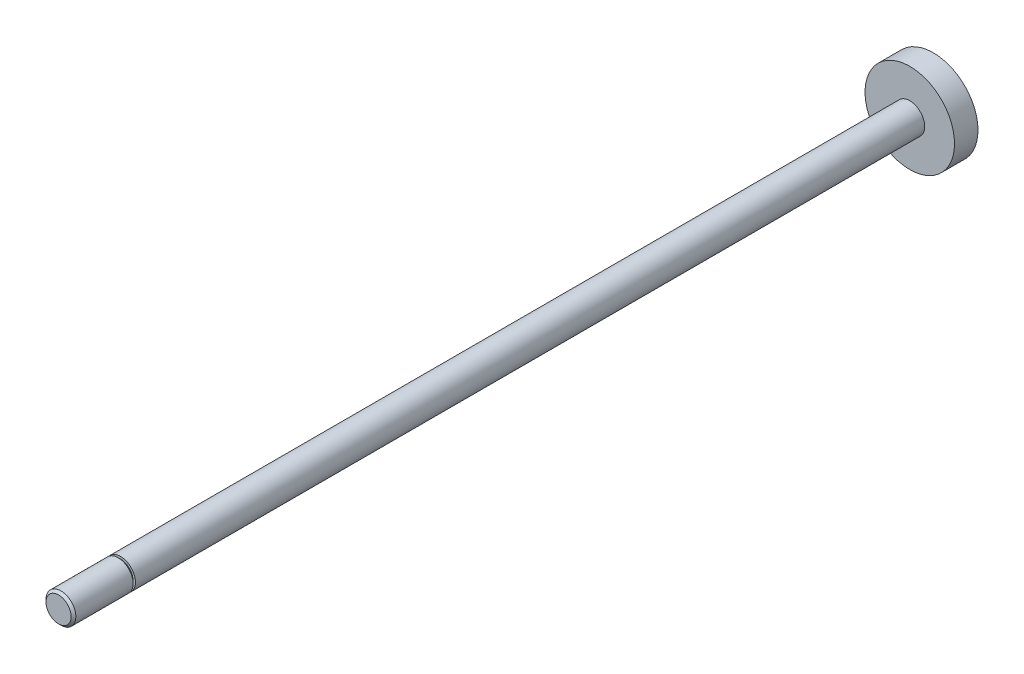
ISO-10303-21;
HEADER;
FILE_DESCRIPTION(('STEP AP214'),'2;1');
FILE_NAME('part.step','',(''),(''),'','','');
FILE_SCHEMA(('AUTOMOTIVE_DESIGN { 1 0 10303 214 1 1 1 1 }'));
ENDSEC;
DATA;
#1=APPLICATION_CONTEXT('core data for automotive mechanical design processes');
#2=APPLICATION_PROTOCOL_DEFINITION('international standard','automotive_design',2000,#1);
#3=PRODUCT_CONTEXT('',#1,'mechanical');
#4=PRODUCT('Part','Part','',(#3));
#5=PRODUCT_RELATED_PRODUCT_CATEGORY('part','',(#4));
#6=PRODUCT_DEFINITION_FORMATION('','',#4);
#7=PRODUCT_DEFINITION_CONTEXT('part definition',#1,'design');
#8=PRODUCT_DEFINITION('design','',#6,#7);
#9=PRODUCT_DEFINITION_SHAPE('','',#8);
#10=(LENGTH_UNIT() NAMED_UNIT(*) SI_UNIT(.MILLI.,.METRE.));
#11=(NAMED_UNIT(*) PLANE_ANGLE_UNIT() SI_UNIT($,.RADIAN.));
#12=(NAMED_UNIT(*) SI_UNIT($,.STERADIAN.) SOLID_ANGLE_UNIT());
#13=UNCERTAINTY_MEASURE_WITH_UNIT(LENGTH_MEASURE(1.E-05),#10,'distance_accuracy_value','');
#14=(GEOMETRIC_REPRESENTATION_CONTEXT(3) GLOBAL_UNCERTAINTY_ASSIGNED_CONTEXT((#13)) GLOBAL_UNIT_ASSIGNED_CONTEXT((#10,
#11,#12)) REPRESENTATION_CONTEXT('',''));
#15=CARTESIAN_POINT('',(0.,0.,0.));
#16=DIRECTION('',(0.,0.,1.));
#17=DIRECTION('',(1.,0.,0.));
#18=AXIS2_PLACEMENT_3D('',#15,#16,#17);
#19=CARTESIAN_POINT('',(0.,0.,2.5));
#20=DIRECTION('',(0.,0.,-1.));
#21=DIRECTION('',(-1.,0.,0.));
#22=AXIS2_PLACEMENT_3D('',#19,#20,#21);
#23=CYLINDRICAL_SURFACE('',#22,9.525);
#24=CARTESIAN_POINT('',(0.,0.,2.5));
#25=DIRECTION('',(0.,0.,1.));
#26=DIRECTION('',(1.,0.,0.));
#27=AXIS2_PLACEMENT_3D('',#24,#25,#26);
#28=CIRCLE('',#27,9.525);
#29=CARTESIAN_POINT('',(9.525,0.,2.5));
#30=VERTEX_POINT('',#29);
#31=EDGE_CURVE('E38',#30,#30,#28,.T.);
#32=ORIENTED_EDGE('',*,*,#31,.F.);
#33=EDGE_LOOP('',(#32));
#34=FACE_BOUND('',#33,.T.);
#35=CARTESIAN_POINT('',(0.,0.,-2.5));
#36=DIRECTION('',(0.,0.,1.));
#37=DIRECTION('',(1.,0.,0.));
#38=AXIS2_PLACEMENT_3D('',#35,#36,#37);
#39=CIRCLE('',#38,9.525);
#40=CARTESIAN_POINT('',(9.525,0.,-2.5));
#41=VERTEX_POINT('',#40);
#42=EDGE_CURVE('E42',#41,#41,#39,.T.);
#43=ORIENTED_EDGE('',*,*,#42,.T.);
#44=EDGE_LOOP('',(#43));
#45=FACE_BOUND('',#44,.T.);
#46=ADVANCED_FACE('F30',(#34,#45),#23,.T.);
#47=CARTESIAN_POINT('',(0.,0.,2.5));
#48=DIRECTION('',(0.,0.,1.));
#49=DIRECTION('',(1.,0.,0.));
#50=AXIS2_PLACEMENT_3D('',#47,#48,#49);
#51=PLANE('',#50);
#52=CARTESIAN_POINT('',(0.,0.,2.5));
#53=DIRECTION('',(0.,0.,1.));
#54=DIRECTION('',(1.,0.,0.));
#55=AXIS2_PLACEMENT_3D('',#52,#53,#54);
#56=CIRCLE('',#55,3.175);
#57=CARTESIAN_POINT('',(3.175,0.,2.5));
#58=VERTEX_POINT('',#57);
#59=EDGE_CURVE('E10',#58,#58,#56,.T.);
#60=ORIENTED_EDGE('',*,*,#59,.F.);
#61=EDGE_LOOP('',(#60));
#62=FACE_BOUND('',#61,.T.);
#63=ORIENTED_EDGE('',*,*,#31,.T.);
#64=EDGE_LOOP('',(#63));
#65=FACE_BOUND('',#64,.T.);
#66=ADVANCED_FACE('F92',(#62,#65),#51,.T.);
#67=CARTESIAN_POINT('',(0.,0.,-2.5));
#68=DIRECTION('',(0.,0.,1.));
#69=DIRECTION('',(1.,0.,0.));
#70=AXIS2_PLACEMENT_3D('',#67,#68,#69);
#71=PLANE('',#70);
#72=ORIENTED_EDGE('',*,*,#42,.F.);
#73=EDGE_LOOP('',(#72));
#74=FACE_BOUND('',#73,.T.);
#75=ADVANCED_FACE('F89',(#74),#71,.F.);
#76=CARTESIAN_POINT('',(0.,0.,192.749256121069));
#77=DIRECTION('',(0.,0.,-1.));
#78=DIRECTION('',(-1.,0.,0.));
#79=AXIS2_PLACEMENT_3D('',#76,#77,#78);
#80=CYLINDRICAL_SURFACE('',#79,3.175);
#81=CARTESIAN_POINT('',(0.,0.,170.569));
#82=DIRECTION('',(0.,0.,-1.));
#83=DIRECTION('',(-1.,0.,0.));
#84=AXIS2_PLACEMENT_3D('',#81,#82,#83);
#85=CIRCLE('',#84,3.175);
#86=CARTESIAN_POINT('',(-3.175,0.,170.569));
#87=VERTEX_POINT('',#86);
#88=EDGE_CURVE('E34',#87,#87,#85,.T.);
#89=ORIENTED_EDGE('',*,*,#88,.T.);
#90=EDGE_LOOP('',(#89));
#91=FACE_BOUND('',#90,.T.);
#92=ORIENTED_EDGE('',*,*,#59,.T.);
#93=EDGE_LOOP('',(#92));
#94=FACE_BOUND('',#93,.T.);
#95=ADVANCED_FACE('F32',(#91,#94),#80,.T.);
#96=CARTESIAN_POINT('',(0.,2.67499999999999,170.569));
#97=DIRECTION('',(0.,0.,-1.));
#98=DIRECTION('',(-1.,0.,0.));
#99=AXIS2_PLACEMENT_3D('',#96,#97,#98);
#100=PLANE('',#99);
#101=CARTESIAN_POINT('',(0.,0.,170.569));
#102=DIRECTION('',(0.,0.,-1.));
#103=DIRECTION('',(-1.,0.,0.));
#104=AXIS2_PLACEMENT_3D('',#101,#102,#103);
#105=CIRCLE('',#104,2.67499999999999);
#106=CARTESIAN_POINT('',(-2.67499999999999,0.,170.569));
#107=VERTEX_POINT('',#106);
#108=EDGE_CURVE('E59',#107,#107,#105,.T.);
#109=ORIENTED_EDGE('',*,*,#108,.T.);
#110=EDGE_LOOP('',(#109));
#111=FACE_BOUND('',#110,.T.);
#112=ORIENTED_EDGE('',*,*,#88,.F.);
#113=EDGE_LOOP('',(#112));
#114=FACE_BOUND('',#113,.T.);
#115=ADVANCED_FACE('F63',(#111,#114),#100,.F.);
#116=CARTESIAN_POINT('',(0.,3.17499999999999,171.069));
#117=DIRECTION('',(0.,0.,1.));
#118=DIRECTION('',(1.,0.,0.));
#119=AXIS2_PLACEMENT_3D('',#116,#117,#118);
#120=PLANE('',#119);
#121=CARTESIAN_POINT('',(0.,0.,171.069));
#122=DIRECTION('',(0.,0.,-1.));
#123=DIRECTION('',(-1.,0.,0.));
#124=AXIS2_PLACEMENT_3D('',#121,#122,#123);
#125=CIRCLE('',#124,2.67499999999999);
#126=CARTESIAN_POINT('',(-2.67499999999999,0.,171.069));
#127=VERTEX_POINT('',#126);
#128=EDGE_CURVE('E56',#127,#127,#125,.T.);
#129=ORIENTED_EDGE('',*,*,#128,.F.);
#130=EDGE_LOOP('',(#129));
#131=FACE_BOUND('',#130,.T.);
#132=CARTESIAN_POINT('',(0.,0.,171.069));
#133=DIRECTION('',(0.,0.,-1.));
#134=DIRECTION('',(-1.,0.,0.));
#135=AXIS2_PLACEMENT_3D('',#132,#133,#134);
#136=CIRCLE('',#135,3.17499999999999);
#137=CARTESIAN_POINT('',(-3.17499999999999,0.,171.069));
#138=VERTEX_POINT('',#137);
#139=EDGE_CURVE('E53',#138,#138,#136,.T.);
#140=ORIENTED_EDGE('',*,*,#139,.T.);
#141=EDGE_LOOP('',(#140));
#142=FACE_BOUND('',#141,.T.);
#143=ADVANCED_FACE('F70',(#131,#142),#120,.F.);
#144=CARTESIAN_POINT('',(0.,0.,0.));
#145=DIRECTION('',(0.,0.,-1.));
#146=DIRECTION('',(-1.,0.,0.));
#147=AXIS2_PLACEMENT_3D('',#144,#145,#146);
#148=CYLINDRICAL_SURFACE('',#147,2.67499999999999);
#149=ORIENTED_EDGE('',*,*,#108,.F.);
#150=EDGE_LOOP('',(#149));
#151=FACE_BOUND('',#150,.T.);
#152=ORIENTED_EDGE('',*,*,#128,.T.);
#153=EDGE_LOOP('',(#152));
#154=FACE_BOUND('',#153,.T.);
#155=ADVANCED_FACE('F66',(#151,#154),#148,.T.);
#156=CARTESIAN_POINT('',(0.,0.,183.269));
#157=DIRECTION('',(0.,0.,-1.));
#158=DIRECTION('',(-1.,0.,0.));
#159=AXIS2_PLACEMENT_3D('',#156,#157,#158);
#160=CIRCLE('',#159,3.17499999999999);
#161=CARTESIAN_POINT('',(-3.17499999999999,0.,183.269));
#162=VERTEX_POINT('',#161);
#163=EDGE_CURVE('E50',#162,#162,#160,.T.);
#164=ORIENTED_EDGE('',*,*,#163,.T.);
#165=EDGE_LOOP('',(#164));
#166=FACE_BOUND('',#165,.T.);
#167=ORIENTED_EDGE('',*,*,#139,.F.);
#168=EDGE_LOOP('',(#167));
#169=FACE_BOUND('',#168,.T.);
#170=ADVANCED_FACE('F69',(#166,#169),#80,.T.);
#171=CARTESIAN_POINT('',(0.,0.,183.769));
#172=DIRECTION('',(0.,0.,-1.));
#173=DIRECTION('',(-1.,0.,0.));
#174=AXIS2_PLACEMENT_3D('',#171,#172,#173);
#175=CONICAL_SURFACE('',#174,2.67499999999999,0.785398163397452);
#176=ORIENTED_EDGE('',*,*,#163,.F.);
#177=EDGE_LOOP('',(#176));
#178=FACE_BOUND('',#177,.T.);
#179=CARTESIAN_POINT('',(0.,0.,183.769));
#180=DIRECTION('',(0.,0.,-1.));
#181=DIRECTION('',(-1.,0.,0.));
#182=AXIS2_PLACEMENT_3D('',#179,#180,#181);
#183=CIRCLE('',#182,2.67499999999999);
#184=CARTESIAN_POINT('',(-2.67499999999999,0.,183.769));
#185=VERTEX_POINT('',#184);
#186=EDGE_CURVE('E47',#185,#185,#183,.T.);
#187=ORIENTED_EDGE('',*,*,#186,.T.);
#188=EDGE_LOOP('',(#187));
#189=FACE_BOUND('',#188,.T.);
#190=ADVANCED_FACE('F80',(#178,#189),#175,.T.);
#191=CARTESIAN_POINT('',(0.,0.,183.769));
#192=DIRECTION('',(0.,0.,-1.));
#193=DIRECTION('',(-1.,0.,0.));
#194=AXIS2_PLACEMENT_3D('',#191,#192,#193);
#195=PLANE('',#194);
#196=ORIENTED_EDGE('',*,*,#186,.F.);
#197=EDGE_LOOP('',(#196));
#198=FACE_BOUND('',#197,.T.);
#199=ADVANCED_FACE('F85',(#198),#195,.F.);
#200=CLOSED_SHELL('',(#46,#66,#75,#95,#115,#143,#155,#170,#190,#199));
#201=MANIFOLD_SOLID_BREP('B2',#200);
#202=ADVANCED_BREP_SHAPE_REPRESENTATION('',(#18,#201),#14);
#203=SHAPE_DEFINITION_REPRESENTATION(#9,#202);
ENDSEC;
END-ISO-10303-21;
